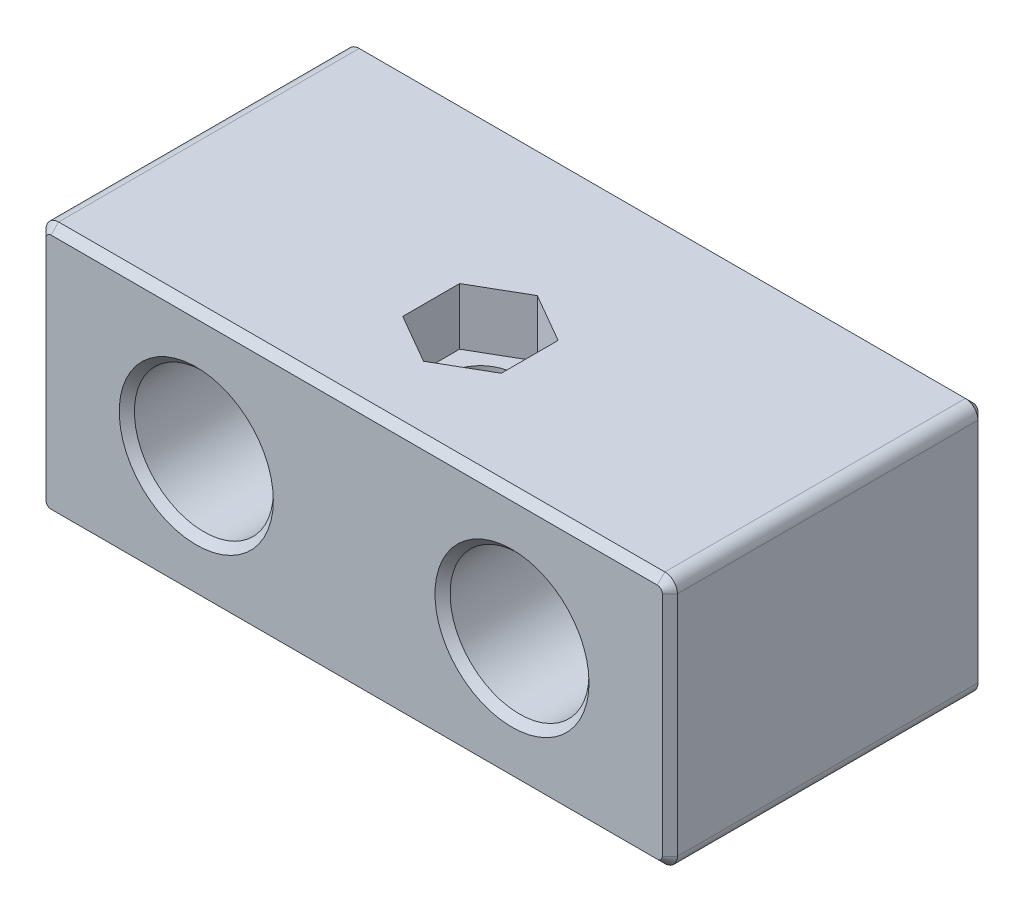
ISO-10303-21;
HEADER;
FILE_DESCRIPTION(('STEP AP214'),'2;1');
FILE_NAME('part.step','',(''),(''),'','','');
FILE_SCHEMA(('AUTOMOTIVE_DESIGN { 1 0 10303 214 1 1 1 1 }'));
ENDSEC;
DATA;
#1=APPLICATION_CONTEXT('core data for automotive mechanical design processes');
#2=APPLICATION_PROTOCOL_DEFINITION('international standard','automotive_design',2000,#1);
#3=PRODUCT_CONTEXT('',#1,'mechanical');
#4=PRODUCT('Part','Part','',(#3));
#5=PRODUCT_RELATED_PRODUCT_CATEGORY('part','',(#4));
#6=PRODUCT_DEFINITION_FORMATION('','',#4);
#7=PRODUCT_DEFINITION_CONTEXT('part definition',#1,'design');
#8=PRODUCT_DEFINITION('design','',#6,#7);
#9=PRODUCT_DEFINITION_SHAPE('','',#8);
#10=(LENGTH_UNIT() NAMED_UNIT(*) SI_UNIT(.MILLI.,.METRE.));
#11=(NAMED_UNIT(*) PLANE_ANGLE_UNIT() SI_UNIT($,.RADIAN.));
#12=(NAMED_UNIT(*) SI_UNIT($,.STERADIAN.) SOLID_ANGLE_UNIT());
#13=UNCERTAINTY_MEASURE_WITH_UNIT(LENGTH_MEASURE(1.E-05),#10,'distance_accuracy_value','');
#14=(GEOMETRIC_REPRESENTATION_CONTEXT(3) GLOBAL_UNCERTAINTY_ASSIGNED_CONTEXT((#13)) GLOBAL_UNIT_ASSIGNED_CONTEXT((#10,
#11,#12)) REPRESENTATION_CONTEXT('',''));
#15=CARTESIAN_POINT('',(0.,0.,0.));
#16=DIRECTION('',(0.,0.,1.));
#17=DIRECTION('',(1.,0.,0.));
#18=AXIS2_PLACEMENT_3D('',#15,#16,#17);
#19=CARTESIAN_POINT('',(0.,-10.,15.));
#20=DIRECTION('',(0.,-1.,0.));
#21=DIRECTION('',(0.,0.,-1.));
#22=AXIS2_PLACEMENT_3D('',#19,#20,#21);
#23=CYLINDRICAL_SURFACE('',#22,2.75);
#24=CARTESIAN_POINT('',(0.,-10.,15.));
#25=DIRECTION('',(0.,-1.,0.));
#26=DIRECTION('',(0.,0.,-1.));
#27=AXIS2_PLACEMENT_3D('',#24,#25,#26);
#28=CIRCLE('',#27,2.75);
#29=CARTESIAN_POINT('',(0.,-10.,12.25));
#30=VERTEX_POINT('',#29);
#31=EDGE_CURVE('E252',#30,#30,#28,.T.);
#32=ORIENTED_EDGE('',*,*,#31,.T.);
#33=EDGE_LOOP('',(#32));
#34=FACE_BOUND('',#33,.T.);
#35=CARTESIAN_POINT('',(0.,5.5,15.));
#36=DIRECTION('',(0.,1.,0.));
#37=DIRECTION('',(0.,0.,1.));
#38=AXIS2_PLACEMENT_3D('',#35,#36,#37);
#39=CIRCLE('',#38,2.75);
#40=CARTESIAN_POINT('',(0.,5.5,17.75));
#41=VERTEX_POINT('',#40);
#42=EDGE_CURVE('E244',#41,#41,#39,.F.);
#43=ORIENTED_EDGE('',*,*,#42,.F.);
#44=EDGE_LOOP('',(#43));
#45=FACE_BOUND('',#44,.T.);
#46=ADVANCED_FACE('F39',(#34,#45),#23,.F.);
#47=CARTESIAN_POINT('',(-25.,-10.,25.));
#48=DIRECTION('',(1.,0.,0.));
#49=DIRECTION('',(0.,0.,-1.));
#50=AXIS2_PLACEMENT_3D('',#47,#48,#49);
#51=PLANE('',#50);
#52=DIRECTION('',(0.,0.,-1.));
#53=VECTOR('',#52,1.);
#54=CARTESIAN_POINT('',(-25.,-9.,25.));
#55=LINE('',#54,#53);
#56=CARTESIAN_POINT('',(-25.,-9.,0.599999999999996));
#57=VERTEX_POINT('',#56);
#58=CARTESIAN_POINT('',(-25.,-9.,24.4));
#59=VERTEX_POINT('',#58);
#60=EDGE_CURVE('E267',#57,#59,#55,.F.);
#61=ORIENTED_EDGE('',*,*,#60,.T.);
#62=DIRECTION('',(0.,1.,0.));
#63=VECTOR('',#62,1.);
#64=CARTESIAN_POINT('',(-25.,9.,24.4));
#65=LINE('',#64,#63);
#66=CARTESIAN_POINT('',(-25.,9.,24.4));
#67=VERTEX_POINT('',#66);
#68=EDGE_CURVE('E340',#59,#67,#65,.T.);
#69=ORIENTED_EDGE('',*,*,#68,.T.);
#70=DIRECTION('',(0.,0.,-1.));
#71=VECTOR('',#70,1.);
#72=CARTESIAN_POINT('',(-25.,9.,25.));
#73=LINE('',#72,#71);
#74=CARTESIAN_POINT('',(-25.,9.,0.599999999999996));
#75=VERTEX_POINT('',#74);
#76=EDGE_CURVE('E272',#67,#75,#73,.T.);
#77=ORIENTED_EDGE('',*,*,#76,.T.);
#78=DIRECTION('',(0.,-1.,0.));
#79=VECTOR('',#78,1.);
#80=CARTESIAN_POINT('',(-25.,-10.,0.599999999999996));
#81=LINE('',#80,#79);
#82=EDGE_CURVE('E338',#75,#57,#81,.T.);
#83=ORIENTED_EDGE('',*,*,#82,.T.);
#84=EDGE_LOOP('',(#61,#69,#77,#83));
#85=FACE_BOUND('',#84,.T.);
#86=ADVANCED_FACE('F494',(#85),#51,.F.);
#87=CARTESIAN_POINT('',(25.,-9.99999999999999,25.));
#88=DIRECTION('',(0.,1.,0.));
#89=DIRECTION('',(-1.,0.,0.));
#90=AXIS2_PLACEMENT_3D('',#87,#88,#89);
#91=PLANE('',#90);
#92=ORIENTED_EDGE('',*,*,#31,.F.);
#93=EDGE_LOOP('',(#92));
#94=FACE_BOUND('',#93,.T.);
#95=DIRECTION('',(0.,0.,-1.));
#96=VECTOR('',#95,1.);
#97=CARTESIAN_POINT('',(24.,-9.99999999999999,25.));
#98=LINE('',#97,#96);
#99=CARTESIAN_POINT('',(24.,-9.99999999999999,0.599999999999996));
#100=VERTEX_POINT('',#99);
#101=CARTESIAN_POINT('',(24.,-9.99999999999999,24.4));
#102=VERTEX_POINT('',#101);
#103=EDGE_CURVE('E281',#100,#102,#98,.F.);
#104=ORIENTED_EDGE('',*,*,#103,.T.);
#105=DIRECTION('',(-1.,0.,0.));
#106=VECTOR('',#105,1.);
#107=CARTESIAN_POINT('',(-24.,-10.,24.4));
#108=LINE('',#107,#106);
#109=CARTESIAN_POINT('',(-24.,-10.,24.4));
#110=VERTEX_POINT('',#109);
#111=EDGE_CURVE('E331',#102,#110,#108,.T.);
#112=ORIENTED_EDGE('',*,*,#111,.T.);
#113=DIRECTION('',(0.,0.,-1.));
#114=VECTOR('',#113,1.);
#115=CARTESIAN_POINT('',(-24.,-10.,25.));
#116=LINE('',#115,#114);
#117=CARTESIAN_POINT('',(-24.,-10.,0.599999999999996));
#118=VERTEX_POINT('',#117);
#119=EDGE_CURVE('E284',#110,#118,#116,.T.);
#120=ORIENTED_EDGE('',*,*,#119,.T.);
#121=DIRECTION('',(1.,0.,0.));
#122=VECTOR('',#121,1.);
#123=CARTESIAN_POINT('',(25.,-9.99999999999999,0.599999999999996));
#124=LINE('',#123,#122);
#125=EDGE_CURVE('E329',#118,#100,#124,.T.);
#126=ORIENTED_EDGE('',*,*,#125,.T.);
#127=EDGE_LOOP('',(#104,#112,#120,#126));
#128=FACE_BOUND('',#127,.T.);
#129=ADVANCED_FACE('F477',(#94,#128),#91,.F.);
#130=CARTESIAN_POINT('',(25.,-9.99999999999999,25.));
#131=DIRECTION('',(-1.,0.,0.));
#132=DIRECTION('',(0.,0.,1.));
#133=AXIS2_PLACEMENT_3D('',#130,#131,#132);
#134=PLANE('',#133);
#135=DIRECTION('',(0.,0.,-1.));
#136=VECTOR('',#135,1.);
#137=CARTESIAN_POINT('',(25.,9.00000000000001,25.));
#138=LINE('',#137,#136);
#139=CARTESIAN_POINT('',(25.,9.00000000000001,0.599999999999996));
#140=VERTEX_POINT('',#139);
#141=CARTESIAN_POINT('',(25.,9.00000000000001,24.4));
#142=VERTEX_POINT('',#141);
#143=EDGE_CURVE('E290',#140,#142,#138,.F.);
#144=ORIENTED_EDGE('',*,*,#143,.T.);
#145=DIRECTION('',(0.,-1.,0.));
#146=VECTOR('',#145,1.);
#147=CARTESIAN_POINT('',(25.,-8.99999999999999,24.4));
#148=LINE('',#147,#146);
#149=CARTESIAN_POINT('',(25.,-8.99999999999999,24.4));
#150=VERTEX_POINT('',#149);
#151=EDGE_CURVE('E323',#142,#150,#148,.T.);
#152=ORIENTED_EDGE('',*,*,#151,.T.);
#153=DIRECTION('',(0.,0.,-1.));
#154=VECTOR('',#153,1.);
#155=CARTESIAN_POINT('',(25.,-8.99999999999999,25.));
#156=LINE('',#155,#154);
#157=CARTESIAN_POINT('',(25.,-8.99999999999999,0.599999999999996));
#158=VERTEX_POINT('',#157);
#159=EDGE_CURVE('E287',#150,#158,#156,.T.);
#160=ORIENTED_EDGE('',*,*,#159,.T.);
#161=DIRECTION('',(0.,1.,0.));
#162=VECTOR('',#161,1.);
#163=CARTESIAN_POINT('',(25.,-9.99999999999999,0.599999999999996));
#164=LINE('',#163,#162);
#165=EDGE_CURVE('E321',#158,#140,#164,.T.);
#166=ORIENTED_EDGE('',*,*,#165,.T.);
#167=EDGE_LOOP('',(#144,#152,#160,#166));
#168=FACE_BOUND('',#167,.T.);
#169=ADVANCED_FACE('F451',(#168),#134,.F.);
#170=CARTESIAN_POINT('',(25.,10.,25.));
#171=DIRECTION('',(0.,-1.,0.));
#172=DIRECTION('',(1.,0.,0.));
#173=AXIS2_PLACEMENT_3D('',#170,#171,#172);
#174=PLANE('',#173);
#175=DIRECTION('',(-0.866025403784436,0.,-0.500000000000004));
#176=VECTOR('',#175,1.);
#177=CARTESIAN_POINT('',(3.90000000000001,10.,12.7483339501605));
#178=LINE('',#177,#176);
#179=CARTESIAN_POINT('',(3.90000000000001,10.,12.7483339501605));
#180=VERTEX_POINT('',#179);
#181=CARTESIAN_POINT('',(0.,10.,10.4966679003209));
#182=VERTEX_POINT('',#181);
#183=EDGE_CURVE('E231',#180,#182,#178,.T.);
#184=ORIENTED_EDGE('',*,*,#183,.F.);
#185=DIRECTION('',(0.,0.,-1.));
#186=VECTOR('',#185,1.);
#187=CARTESIAN_POINT('',(3.89999999999999,10.,17.2516660498396));
#188=LINE('',#187,#186);
#189=CARTESIAN_POINT('',(3.89999999999999,10.,17.2516660498396));
#190=VERTEX_POINT('',#189);
#191=EDGE_CURVE('E198',#190,#180,#188,.T.);
#192=ORIENTED_EDGE('',*,*,#191,.F.);
#193=DIRECTION('',(0.866025403784441,0.,-0.499999999999996));
#194=VECTOR('',#193,1.);
#195=CARTESIAN_POINT('',(0.,10.,19.5033320996791));
#196=LINE('',#195,#194);
#197=CARTESIAN_POINT('',(0.,10.,19.5033320996791));
#198=VERTEX_POINT('',#197);
#199=EDGE_CURVE('E217',#198,#190,#196,.T.);
#200=ORIENTED_EDGE('',*,*,#199,.F.);
#201=DIRECTION('',(0.866025403784436,0.,0.500000000000005));
#202=VECTOR('',#201,1.);
#203=CARTESIAN_POINT('',(-3.90000000000001,10.,17.2516660498395));
#204=LINE('',#203,#202);
#205=CARTESIAN_POINT('',(-3.90000000000001,10.,17.2516660498395));
#206=VERTEX_POINT('',#205);
#207=EDGE_CURVE('E220',#206,#198,#204,.T.);
#208=ORIENTED_EDGE('',*,*,#207,.F.);
#209=DIRECTION('',(0.,0.,1.));
#210=VECTOR('',#209,1.);
#211=CARTESIAN_POINT('',(-3.89999999999999,10.,12.7483339501604));
#212=LINE('',#211,#210);
#213=CARTESIAN_POINT('',(-3.89999999999999,10.,12.7483339501604));
#214=VERTEX_POINT('',#213);
#215=EDGE_CURVE('E237',#214,#206,#212,.T.);
#216=ORIENTED_EDGE('',*,*,#215,.F.);
#217=DIRECTION('',(-0.866025403784441,0.,0.499999999999996));
#218=VECTOR('',#217,1.);
#219=CARTESIAN_POINT('',(0.,10.,10.4966679003209));
#220=LINE('',#219,#218);
#221=EDGE_CURVE('E234',#182,#214,#220,.T.);
#222=ORIENTED_EDGE('',*,*,#221,.F.);
#223=EDGE_LOOP('',(#184,#192,#200,#208,#216,#222));
#224=FACE_BOUND('',#223,.T.);
#225=DIRECTION('',(0.,0.,-1.));
#226=VECTOR('',#225,1.);
#227=CARTESIAN_POINT('',(-24.,10.,25.));
#228=LINE('',#227,#226);
#229=CARTESIAN_POINT('',(-24.,10.,0.599999999999996));
#230=VERTEX_POINT('',#229);
#231=CARTESIAN_POINT('',(-24.,10.,24.4));
#232=VERTEX_POINT('',#231);
#233=EDGE_CURVE('E278',#230,#232,#228,.F.);
#234=ORIENTED_EDGE('',*,*,#233,.T.);
#235=DIRECTION('',(1.,0.,0.));
#236=VECTOR('',#235,1.);
#237=CARTESIAN_POINT('',(24.,10.,24.4));
#238=LINE('',#237,#236);
#239=CARTESIAN_POINT('',(24.,10.,24.4));
#240=VERTEX_POINT('',#239);
#241=EDGE_CURVE('E348',#232,#240,#238,.T.);
#242=ORIENTED_EDGE('',*,*,#241,.T.);
#243=DIRECTION('',(0.,0.,-1.));
#244=VECTOR('',#243,1.);
#245=CARTESIAN_POINT('',(24.,10.,25.));
#246=LINE('',#245,#244);
#247=CARTESIAN_POINT('',(24.,10.,0.599999999999996));
#248=VERTEX_POINT('',#247);
#249=EDGE_CURVE('E275',#240,#248,#246,.T.);
#250=ORIENTED_EDGE('',*,*,#249,.T.);
#251=DIRECTION('',(-1.,0.,0.));
#252=VECTOR('',#251,1.);
#253=CARTESIAN_POINT('',(25.,10.,0.599999999999996));
#254=LINE('',#253,#252);
#255=EDGE_CURVE('E346',#248,#230,#254,.T.);
#256=ORIENTED_EDGE('',*,*,#255,.T.);
#257=EDGE_LOOP('',(#234,#242,#250,#256));
#258=FACE_BOUND('',#257,.T.);
#259=ADVANCED_FACE('F437',(#224,#258),#174,.F.);
#260=CARTESIAN_POINT('',(0.,0.,25.));
#261=DIRECTION('',(0.,0.,1.));
#262=DIRECTION('',(1.,0.,0.));
#263=AXIS2_PLACEMENT_3D('',#260,#261,#262);
#264=PLANE('',#263);
#265=DIRECTION('',(0.,1.,0.));
#266=VECTOR('',#265,1.);
#267=CARTESIAN_POINT('',(24.4,9.00000000000001,25.));
#268=LINE('',#267,#266);
#269=CARTESIAN_POINT('',(24.4,-8.99999999999999,25.));
#270=VERTEX_POINT('',#269);
#271=CARTESIAN_POINT('',(24.4,9.00000000000001,25.));
#272=VERTEX_POINT('',#271);
#273=EDGE_CURVE('E311',#270,#272,#268,.T.);
#274=ORIENTED_EDGE('',*,*,#273,.T.);
#275=CARTESIAN_POINT('',(24.,9.00000000000001,25.));
#276=DIRECTION('',(0.,0.,1.));
#277=DIRECTION('',(1.,0.,0.));
#278=AXIS2_PLACEMENT_3D('',#275,#276,#277);
#279=CIRCLE('',#278,0.400000000000018);
#280=CARTESIAN_POINT('',(24.,9.40000000000002,25.));
#281=VERTEX_POINT('',#280);
#282=EDGE_CURVE('E313',#272,#281,#279,.T.);
#283=ORIENTED_EDGE('',*,*,#282,.T.);
#284=DIRECTION('',(-1.,0.,0.));
#285=VECTOR('',#284,1.);
#286=CARTESIAN_POINT('',(-24.,9.40000000000002,25.));
#287=LINE('',#286,#285);
#288=CARTESIAN_POINT('',(-24.,9.40000000000002,25.));
#289=VERTEX_POINT('',#288);
#290=EDGE_CURVE('E299',#281,#289,#287,.T.);
#291=ORIENTED_EDGE('',*,*,#290,.T.);
#292=CARTESIAN_POINT('',(-24.,9.,25.));
#293=DIRECTION('',(0.,0.,1.));
#294=DIRECTION('',(1.,0.,0.));
#295=AXIS2_PLACEMENT_3D('',#292,#293,#294);
#296=CIRCLE('',#295,0.400000000000018);
#297=CARTESIAN_POINT('',(-24.4,9.,25.));
#298=VERTEX_POINT('',#297);
#299=EDGE_CURVE('E301',#289,#298,#296,.T.);
#300=ORIENTED_EDGE('',*,*,#299,.T.);
#301=DIRECTION('',(0.,-1.,0.));
#302=VECTOR('',#301,1.);
#303=CARTESIAN_POINT('',(-24.4,-9.,25.));
#304=LINE('',#303,#302);
#305=CARTESIAN_POINT('',(-24.4,-9.,25.));
#306=VERTEX_POINT('',#305);
#307=EDGE_CURVE('E303',#298,#306,#304,.T.);
#308=ORIENTED_EDGE('',*,*,#307,.T.);
#309=CARTESIAN_POINT('',(-24.,-9.,25.));
#310=DIRECTION('',(0.,0.,1.));
#311=DIRECTION('',(1.,0.,0.));
#312=AXIS2_PLACEMENT_3D('',#309,#310,#311);
#313=CIRCLE('',#312,0.400000000000018);
#314=CARTESIAN_POINT('',(-24.,-9.40000000000002,25.));
#315=VERTEX_POINT('',#314);
#316=EDGE_CURVE('E305',#306,#315,#313,.T.);
#317=ORIENTED_EDGE('',*,*,#316,.T.);
#318=DIRECTION('',(1.,0.,0.));
#319=VECTOR('',#318,1.);
#320=CARTESIAN_POINT('',(24.,-9.40000000000001,25.));
#321=LINE('',#320,#319);
#322=CARTESIAN_POINT('',(24.,-9.40000000000001,25.));
#323=VERTEX_POINT('',#322);
#324=EDGE_CURVE('E307',#315,#323,#321,.T.);
#325=ORIENTED_EDGE('',*,*,#324,.T.);
#326=CARTESIAN_POINT('',(24.,-8.99999999999999,25.));
#327=DIRECTION('',(0.,0.,1.));
#328=DIRECTION('',(1.,0.,0.));
#329=AXIS2_PLACEMENT_3D('',#326,#327,#328);
#330=CIRCLE('',#329,0.400000000000018);
#331=EDGE_CURVE('E309',#323,#270,#330,.T.);
#332=ORIENTED_EDGE('',*,*,#331,.T.);
#333=EDGE_LOOP('',(#274,#283,#291,#300,#308,#317,#325,#332));
#334=FACE_BOUND('',#333,.T.);
#335=CARTESIAN_POINT('',(12.5,0.,25.));
#336=DIRECTION('',(0.,0.,1.));
#337=DIRECTION('',(1.,0.,0.));
#338=AXIS2_PLACEMENT_3D('',#335,#336,#337);
#339=CIRCLE('',#338,6.10000000000003);
#340=CARTESIAN_POINT('',(18.6,0.,25.));
#341=VERTEX_POINT('',#340);
#342=EDGE_CURVE('E296',#341,#341,#339,.F.);
#343=ORIENTED_EDGE('',*,*,#342,.T.);
#344=EDGE_LOOP('',(#343));
#345=FACE_BOUND('',#344,.T.);
#346=CARTESIAN_POINT('',(-12.5,0.,25.));
#347=DIRECTION('',(0.,0.,1.));
#348=DIRECTION('',(1.,0.,0.));
#349=AXIS2_PLACEMENT_3D('',#346,#347,#348);
#350=CIRCLE('',#349,6.10000000000003);
#351=CARTESIAN_POINT('',(-6.39999999999997,0.,25.));
#352=VERTEX_POINT('',#351);
#353=EDGE_CURVE('E293',#352,#352,#350,.F.);
#354=ORIENTED_EDGE('',*,*,#353,.T.);
#355=EDGE_LOOP('',(#354));
#356=FACE_BOUND('',#355,.T.);
#357=ADVANCED_FACE('F467',(#334,#345,#356),#264,.T.);
#358=CARTESIAN_POINT('',(0.,0.,0.));
#359=DIRECTION('',(0.,0.,1.));
#360=DIRECTION('',(1.,0.,0.));
#361=AXIS2_PLACEMENT_3D('',#358,#359,#360);
#362=PLANE('',#361);
#363=DIRECTION('',(-1.,0.,0.));
#364=VECTOR('',#363,1.);
#365=CARTESIAN_POINT('',(0.,-9.4,0.));
#366=LINE('',#365,#364);
#367=CARTESIAN_POINT('',(24.,-9.4,0.));
#368=VERTEX_POINT('',#367);
#369=CARTESIAN_POINT('',(-24.,-9.40000000000001,0.));
#370=VERTEX_POINT('',#369);
#371=EDGE_CURVE('E57',#368,#370,#366,.T.);
#372=ORIENTED_EDGE('',*,*,#371,.T.);
#373=CARTESIAN_POINT('',(-24.,-9.,0.));
#374=DIRECTION('',(0.,0.,1.));
#375=DIRECTION('',(1.,0.,0.));
#376=AXIS2_PLACEMENT_3D('',#373,#374,#375);
#377=CIRCLE('',#376,0.400000000000005);
#378=CARTESIAN_POINT('',(-24.4,-9.,0.));
#379=VERTEX_POINT('',#378);
#380=EDGE_CURVE('E374',#370,#379,#377,.F.);
#381=ORIENTED_EDGE('',*,*,#380,.T.);
#382=DIRECTION('',(0.,1.,0.));
#383=VECTOR('',#382,1.);
#384=CARTESIAN_POINT('',(-24.4,0.,0.));
#385=LINE('',#384,#383);
#386=CARTESIAN_POINT('',(-24.4,9.,0.));
#387=VERTEX_POINT('',#386);
#388=EDGE_CURVE('E362',#379,#387,#385,.T.);
#389=ORIENTED_EDGE('',*,*,#388,.T.);
#390=CARTESIAN_POINT('',(-24.,9.,0.));
#391=DIRECTION('',(0.,0.,1.));
#392=DIRECTION('',(1.,0.,0.));
#393=AXIS2_PLACEMENT_3D('',#390,#391,#392);
#394=CIRCLE('',#393,0.400000000000005);
#395=CARTESIAN_POINT('',(-24.,9.4,0.));
#396=VERTEX_POINT('',#395);
#397=EDGE_CURVE('E364',#387,#396,#394,.F.);
#398=ORIENTED_EDGE('',*,*,#397,.T.);
#399=DIRECTION('',(1.,0.,0.));
#400=VECTOR('',#399,1.);
#401=CARTESIAN_POINT('',(0.,9.40000000000001,0.));
#402=LINE('',#401,#400);
#403=CARTESIAN_POINT('',(24.,9.40000000000001,0.));
#404=VERTEX_POINT('',#403);
#405=EDGE_CURVE('E366',#396,#404,#402,.T.);
#406=ORIENTED_EDGE('',*,*,#405,.T.);
#407=CARTESIAN_POINT('',(24.,9.00000000000001,0.));
#408=DIRECTION('',(0.,0.,1.));
#409=DIRECTION('',(1.,0.,0.));
#410=AXIS2_PLACEMENT_3D('',#407,#408,#409);
#411=CIRCLE('',#410,0.400000000000005);
#412=CARTESIAN_POINT('',(24.4,9.00000000000001,0.));
#413=VERTEX_POINT('',#412);
#414=EDGE_CURVE('E368',#404,#413,#411,.F.);
#415=ORIENTED_EDGE('',*,*,#414,.T.);
#416=DIRECTION('',(0.,-1.,0.));
#417=VECTOR('',#416,1.);
#418=CARTESIAN_POINT('',(24.4,0.,0.));
#419=LINE('',#418,#417);
#420=CARTESIAN_POINT('',(24.4,-8.99999999999999,0.));
#421=VERTEX_POINT('',#420);
#422=EDGE_CURVE('E370',#413,#421,#419,.T.);
#423=ORIENTED_EDGE('',*,*,#422,.T.);
#424=CARTESIAN_POINT('',(24.,-8.99999999999999,0.));
#425=DIRECTION('',(0.,0.,1.));
#426=DIRECTION('',(1.,0.,0.));
#427=AXIS2_PLACEMENT_3D('',#424,#425,#426);
#428=CIRCLE('',#427,0.400000000000005);
#429=EDGE_CURVE('E62',#421,#368,#428,.F.);
#430=ORIENTED_EDGE('',*,*,#429,.T.);
#431=EDGE_LOOP('',(#372,#381,#389,#398,#406,#415,#423,#430));
#432=FACE_BOUND('',#431,.T.);
#433=CARTESIAN_POINT('',(12.5,0.,0.));
#434=DIRECTION('',(0.,0.,1.));
#435=DIRECTION('',(1.,0.,0.));
#436=AXIS2_PLACEMENT_3D('',#433,#434,#435);
#437=CIRCLE('',#436,3.8);
#438=CARTESIAN_POINT('',(16.3,0.,0.));
#439=VERTEX_POINT('',#438);
#440=EDGE_CURVE('E359',#439,#439,#437,.T.);
#441=ORIENTED_EDGE('',*,*,#440,.T.);
#442=EDGE_LOOP('',(#441));
#443=FACE_BOUND('',#442,.T.);
#444=CARTESIAN_POINT('',(-12.5,0.,0.));
#445=DIRECTION('',(0.,0.,1.));
#446=DIRECTION('',(1.,0.,0.));
#447=AXIS2_PLACEMENT_3D('',#444,#445,#446);
#448=CIRCLE('',#447,3.79999999999999);
#449=CARTESIAN_POINT('',(-8.70000000000001,0.,0.));
#450=VERTEX_POINT('',#449);
#451=EDGE_CURVE('E356',#450,#450,#448,.T.);
#452=ORIENTED_EDGE('',*,*,#451,.T.);
#453=EDGE_LOOP('',(#452));
#454=FACE_BOUND('',#453,.T.);
#455=ADVANCED_FACE('F560',(#432,#443,#454),#362,.F.);
#456=CARTESIAN_POINT('',(12.5,0.,25.));
#457=DIRECTION('',(0.,0.,1.));
#458=DIRECTION('',(1.,0.,0.));
#459=AXIS2_PLACEMENT_3D('',#456,#457,#458);
#460=CYLINDRICAL_SURFACE('',#459,3.2);
#461=CARTESIAN_POINT('',(12.5,0.,0.6));
#462=DIRECTION('',(0.,0.,1.));
#463=DIRECTION('',(1.,0.,0.));
#464=AXIS2_PLACEMENT_3D('',#461,#462,#463);
#465=CIRCLE('',#464,3.2);
#466=CARTESIAN_POINT('',(15.7,0.,0.6));
#467=VERTEX_POINT('',#466);
#468=EDGE_CURVE('E49',#467,#467,#465,.F.);
#469=ORIENTED_EDGE('',*,*,#468,.T.);
#470=EDGE_LOOP('',(#469));
#471=FACE_BOUND('',#470,.T.);
#472=CARTESIAN_POINT('',(12.5,0.,13.));
#473=DIRECTION('',(0.,0.,1.));
#474=DIRECTION('',(1.,0.,0.));
#475=AXIS2_PLACEMENT_3D('',#472,#473,#474);
#476=CIRCLE('',#475,3.2);
#477=CARTESIAN_POINT('',(15.7,0.,13.));
#478=VERTEX_POINT('',#477);
#479=EDGE_CURVE('E264',#478,#478,#476,.T.);
#480=ORIENTED_EDGE('',*,*,#479,.T.);
#481=EDGE_LOOP('',(#480));
#482=FACE_BOUND('',#481,.T.);
#483=ADVANCED_FACE('F556',(#471,#482),#460,.F.);
#484=CARTESIAN_POINT('',(15.7,0.,13.));
#485=DIRECTION('',(0.,0.,-1.));
#486=DIRECTION('',(-1.,0.,0.));
#487=AXIS2_PLACEMENT_3D('',#484,#485,#486);
#488=PLANE('',#487);
#489=ORIENTED_EDGE('',*,*,#479,.F.);
#490=EDGE_LOOP('',(#489));
#491=FACE_BOUND('',#490,.T.);
#492=CARTESIAN_POINT('',(12.5,0.,13.));
#493=DIRECTION('',(0.,0.,1.));
#494=DIRECTION('',(1.,0.,0.));
#495=AXIS2_PLACEMENT_3D('',#492,#493,#494);
#496=CIRCLE('',#495,5.5);
#497=CARTESIAN_POINT('',(18.,0.,13.));
#498=VERTEX_POINT('',#497);
#499=EDGE_CURVE('E261',#498,#498,#496,.T.);
#500=ORIENTED_EDGE('',*,*,#499,.T.);
#501=EDGE_LOOP('',(#500));
#502=FACE_BOUND('',#501,.T.);
#503=ADVANCED_FACE('F552',(#491,#502),#488,.F.);
#504=CARTESIAN_POINT('',(12.5,0.,25.));
#505=DIRECTION('',(0.,0.,1.));
#506=DIRECTION('',(1.,0.,0.));
#507=AXIS2_PLACEMENT_3D('',#504,#505,#506);
#508=CYLINDRICAL_SURFACE('',#507,5.5);
#509=CARTESIAN_POINT('',(12.5,0.,24.4));
#510=DIRECTION('',(0.,0.,1.));
#511=DIRECTION('',(1.,0.,0.));
#512=AXIS2_PLACEMENT_3D('',#509,#510,#511);
#513=CIRCLE('',#512,5.5);
#514=CARTESIAN_POINT('',(18.,0.,24.4));
#515=VERTEX_POINT('',#514);
#516=EDGE_CURVE('E350',#515,#515,#513,.T.);
#517=ORIENTED_EDGE('',*,*,#516,.T.);
#518=EDGE_LOOP('',(#517));
#519=FACE_BOUND('',#518,.T.);
#520=ORIENTED_EDGE('',*,*,#499,.F.);
#521=EDGE_LOOP('',(#520));
#522=FACE_BOUND('',#521,.T.);
#523=ADVANCED_FACE('F548',(#519,#522),#508,.F.);
#524=CARTESIAN_POINT('',(-12.5,0.,25.));
#525=DIRECTION('',(0.,0.,1.));
#526=DIRECTION('',(1.,0.,0.));
#527=AXIS2_PLACEMENT_3D('',#524,#525,#526);
#528=CYLINDRICAL_SURFACE('',#527,3.2);
#529=CARTESIAN_POINT('',(-12.5,0.,0.600000000000003));
#530=DIRECTION('',(0.,0.,1.));
#531=DIRECTION('',(1.,0.,0.));
#532=AXIS2_PLACEMENT_3D('',#529,#530,#531);
#533=CIRCLE('',#532,3.2);
#534=CARTESIAN_POINT('',(-9.3,0.,0.600000000000003));
#535=VERTEX_POINT('',#534);
#536=EDGE_CURVE('E11',#535,#535,#533,.F.);
#537=ORIENTED_EDGE('',*,*,#536,.T.);
#538=EDGE_LOOP('',(#537));
#539=FACE_BOUND('',#538,.T.);
#540=CARTESIAN_POINT('',(-12.5,0.,13.));
#541=DIRECTION('',(0.,0.,1.));
#542=DIRECTION('',(1.,0.,0.));
#543=AXIS2_PLACEMENT_3D('',#540,#541,#542);
#544=CIRCLE('',#543,3.2);
#545=CARTESIAN_POINT('',(-9.3,0.,13.));
#546=VERTEX_POINT('',#545);
#547=EDGE_CURVE('E258',#546,#546,#544,.T.);
#548=ORIENTED_EDGE('',*,*,#547,.T.);
#549=EDGE_LOOP('',(#548));
#550=FACE_BOUND('',#549,.T.);
#551=ADVANCED_FACE('F544',(#539,#550),#528,.F.);
#552=CARTESIAN_POINT('',(-9.3,0.,13.));
#553=DIRECTION('',(0.,0.,-1.));
#554=DIRECTION('',(-1.,0.,0.));
#555=AXIS2_PLACEMENT_3D('',#552,#553,#554);
#556=PLANE('',#555);
#557=ORIENTED_EDGE('',*,*,#547,.F.);
#558=EDGE_LOOP('',(#557));
#559=FACE_BOUND('',#558,.T.);
#560=CARTESIAN_POINT('',(-12.5,0.,13.));
#561=DIRECTION('',(0.,0.,1.));
#562=DIRECTION('',(1.,0.,0.));
#563=AXIS2_PLACEMENT_3D('',#560,#561,#562);
#564=CIRCLE('',#563,5.5);
#565=CARTESIAN_POINT('',(-7.,0.,13.));
#566=VERTEX_POINT('',#565);
#567=EDGE_CURVE('E255',#566,#566,#564,.T.);
#568=ORIENTED_EDGE('',*,*,#567,.T.);
#569=EDGE_LOOP('',(#568));
#570=FACE_BOUND('',#569,.T.);
#571=ADVANCED_FACE('F540',(#559,#570),#556,.F.);
#572=CARTESIAN_POINT('',(-12.5,0.,25.));
#573=DIRECTION('',(0.,0.,1.));
#574=DIRECTION('',(1.,0.,0.));
#575=AXIS2_PLACEMENT_3D('',#572,#573,#574);
#576=CYLINDRICAL_SURFACE('',#575,5.5);
#577=CARTESIAN_POINT('',(-12.5,0.,24.4));
#578=DIRECTION('',(0.,0.,1.));
#579=DIRECTION('',(1.,0.,0.));
#580=AXIS2_PLACEMENT_3D('',#577,#578,#579);
#581=CIRCLE('',#580,5.5);
#582=CARTESIAN_POINT('',(-7.,0.,24.4));
#583=VERTEX_POINT('',#582);
#584=EDGE_CURVE('E353',#583,#583,#581,.T.);
#585=ORIENTED_EDGE('',*,*,#584,.T.);
#586=EDGE_LOOP('',(#585));
#587=FACE_BOUND('',#586,.T.);
#588=ORIENTED_EDGE('',*,*,#567,.F.);
#589=EDGE_LOOP('',(#588));
#590=FACE_BOUND('',#589,.T.);
#591=ADVANCED_FACE('F537',(#587,#590),#576,.F.);
#592=CARTESIAN_POINT('',(0.,5.5,0.));
#593=DIRECTION('',(0.,1.,0.));
#594=DIRECTION('',(0.,0.,1.));
#595=AXIS2_PLACEMENT_3D('',#592,#593,#594);
#596=PLANE('',#595);
#597=DIRECTION('',(0.,0.,-1.));
#598=VECTOR('',#597,1.);
#599=CARTESIAN_POINT('',(3.89999999999999,5.5,17.2516660498396));
#600=LINE('',#599,#598);
#601=CARTESIAN_POINT('',(3.89999999999999,5.5,17.2516660498396));
#602=VERTEX_POINT('',#601);
#603=CARTESIAN_POINT('',(3.90000000000001,5.5,12.7483339501605));
#604=VERTEX_POINT('',#603);
#605=EDGE_CURVE('E195',#602,#604,#600,.T.);
#606=ORIENTED_EDGE('',*,*,#605,.T.);
#607=DIRECTION('',(-0.866025403784436,0.,-0.500000000000004));
#608=VECTOR('',#607,1.);
#609=CARTESIAN_POINT('',(3.90000000000001,5.5,12.7483339501605));
#610=LINE('',#609,#608);
#611=CARTESIAN_POINT('',(0.,5.5,10.4966679003209));
#612=VERTEX_POINT('',#611);
#613=EDGE_CURVE('E206',#604,#612,#610,.T.);
#614=ORIENTED_EDGE('',*,*,#613,.T.);
#615=DIRECTION('',(-0.866025403784441,0.,0.499999999999996));
#616=VECTOR('',#615,1.);
#617=CARTESIAN_POINT('',(0.,5.5,10.4966679003209));
#618=LINE('',#617,#616);
#619=CARTESIAN_POINT('',(-3.89999999999999,5.5,12.7483339501604));
#620=VERTEX_POINT('',#619);
#621=EDGE_CURVE('E211',#612,#620,#618,.T.);
#622=ORIENTED_EDGE('',*,*,#621,.T.);
#623=DIRECTION('',(0.,0.,1.));
#624=VECTOR('',#623,1.);
#625=CARTESIAN_POINT('',(-3.89999999999999,5.5,12.7483339501604));
#626=LINE('',#625,#624);
#627=CARTESIAN_POINT('',(-3.90000000000001,5.5,17.2516660498395));
#628=VERTEX_POINT('',#627);
#629=EDGE_CURVE('E224',#620,#628,#626,.T.);
#630=ORIENTED_EDGE('',*,*,#629,.T.);
#631=DIRECTION('',(0.866025403784436,0.,0.500000000000005));
#632=VECTOR('',#631,1.);
#633=CARTESIAN_POINT('',(-3.90000000000001,5.5,17.2516660498395));
#634=LINE('',#633,#632);
#635=CARTESIAN_POINT('',(0.,5.5,19.5033320996791));
#636=VERTEX_POINT('',#635);
#637=EDGE_CURVE('E227',#628,#636,#634,.T.);
#638=ORIENTED_EDGE('',*,*,#637,.T.);
#639=DIRECTION('',(0.866025403784441,0.,-0.499999999999996));
#640=VECTOR('',#639,1.);
#641=CARTESIAN_POINT('',(0.,5.5,19.5033320996791));
#642=LINE('',#641,#640);
#643=EDGE_CURVE('E203',#636,#602,#642,.T.);
#644=ORIENTED_EDGE('',*,*,#643,.T.);
#645=EDGE_LOOP('',(#606,#614,#622,#630,#638,#644));
#646=FACE_BOUND('',#645,.T.);
#647=ORIENTED_EDGE('',*,*,#42,.T.);
#648=EDGE_LOOP('',(#647));
#649=FACE_BOUND('',#648,.T.);
#650=ADVANCED_FACE('F213',(#646,#649),#596,.T.);
#651=CARTESIAN_POINT('',(3.89999999999999,5.5,17.2516660498396));
#652=DIRECTION('',(1.,0.,0.));
#653=DIRECTION('',(0.,0.,-1.));
#654=AXIS2_PLACEMENT_3D('',#651,#652,#653);
#655=PLANE('',#654);
#656=ORIENTED_EDGE('',*,*,#191,.T.);
#657=DIRECTION('',(0.,1.,0.));
#658=VECTOR('',#657,1.);
#659=CARTESIAN_POINT('',(3.90000000000001,5.5,12.7483339501605));
#660=LINE('',#659,#658);
#661=EDGE_CURVE('E191',#604,#180,#660,.T.);
#662=ORIENTED_EDGE('',*,*,#661,.F.);
#663=ORIENTED_EDGE('',*,*,#605,.F.);
#664=DIRECTION('',(0.,1.,0.));
#665=VECTOR('',#664,1.);
#666=CARTESIAN_POINT('',(3.89999999999999,5.5,17.2516660498396));
#667=LINE('',#666,#665);
#668=EDGE_CURVE('E242',#602,#190,#667,.T.);
#669=ORIENTED_EDGE('',*,*,#668,.T.);
#670=EDGE_LOOP('',(#656,#662,#663,#669));
#671=FACE_BOUND('',#670,.T.);
#672=ADVANCED_FACE('F193',(#671),#655,.F.);
#673=CARTESIAN_POINT('',(0.,5.5,19.5033320996791));
#674=DIRECTION('',(0.499999999999996,0.,0.866025403784441));
#675=DIRECTION('',(0.866025403784441,0.,-0.499999999999996));
#676=AXIS2_PLACEMENT_3D('',#673,#674,#675);
#677=PLANE('',#676);
#678=ORIENTED_EDGE('',*,*,#199,.T.);
#679=ORIENTED_EDGE('',*,*,#668,.F.);
#680=ORIENTED_EDGE('',*,*,#643,.F.);
#681=DIRECTION('',(0.,1.,0.));
#682=VECTOR('',#681,1.);
#683=CARTESIAN_POINT('',(0.,5.5,19.5033320996791));
#684=LINE('',#683,#682);
#685=EDGE_CURVE('E245',#636,#198,#684,.T.);
#686=ORIENTED_EDGE('',*,*,#685,.T.);
#687=EDGE_LOOP('',(#678,#679,#680,#686));
#688=FACE_BOUND('',#687,.T.);
#689=ADVANCED_FACE('F972',(#688),#677,.F.);
#690=CARTESIAN_POINT('',(-3.90000000000001,5.5,17.2516660498395));
#691=DIRECTION('',(-0.500000000000005,0.,0.866025403784436));
#692=DIRECTION('',(0.866025403784436,0.,0.500000000000005));
#693=AXIS2_PLACEMENT_3D('',#690,#691,#692);
#694=PLANE('',#693);
#695=ORIENTED_EDGE('',*,*,#207,.T.);
#696=ORIENTED_EDGE('',*,*,#685,.F.);
#697=ORIENTED_EDGE('',*,*,#637,.F.);
#698=DIRECTION('',(0.,1.,0.));
#699=VECTOR('',#698,1.);
#700=CARTESIAN_POINT('',(-3.90000000000001,5.5,17.2516660498395));
#701=LINE('',#700,#699);
#702=EDGE_CURVE('E247',#628,#206,#701,.T.);
#703=ORIENTED_EDGE('',*,*,#702,.T.);
#704=EDGE_LOOP('',(#695,#696,#697,#703));
#705=FACE_BOUND('',#704,.T.);
#706=ADVANCED_FACE('F961',(#705),#694,.F.);
#707=CARTESIAN_POINT('',(-3.89999999999999,5.5,12.7483339501604));
#708=DIRECTION('',(-1.,0.,0.));
#709=DIRECTION('',(0.,0.,1.));
#710=AXIS2_PLACEMENT_3D('',#707,#708,#709);
#711=PLANE('',#710);
#712=ORIENTED_EDGE('',*,*,#215,.T.);
#713=ORIENTED_EDGE('',*,*,#702,.F.);
#714=ORIENTED_EDGE('',*,*,#629,.F.);
#715=DIRECTION('',(0.,1.,0.));
#716=VECTOR('',#715,1.);
#717=CARTESIAN_POINT('',(-3.89999999999999,5.5,12.7483339501604));
#718=LINE('',#717,#716);
#719=EDGE_CURVE('E249',#620,#214,#718,.T.);
#720=ORIENTED_EDGE('',*,*,#719,.T.);
#721=EDGE_LOOP('',(#712,#713,#714,#720));
#722=FACE_BOUND('',#721,.T.);
#723=ADVANCED_FACE('F950',(#722),#711,.F.);
#724=CARTESIAN_POINT('',(0.,5.5,10.4966679003209));
#725=DIRECTION('',(-0.499999999999996,0.,-0.866025403784441));
#726=DIRECTION('',(-0.866025403784441,0.,0.499999999999996));
#727=AXIS2_PLACEMENT_3D('',#724,#725,#726);
#728=PLANE('',#727);
#729=ORIENTED_EDGE('',*,*,#221,.T.);
#730=ORIENTED_EDGE('',*,*,#719,.F.);
#731=ORIENTED_EDGE('',*,*,#621,.F.);
#732=DIRECTION('',(0.,1.,0.));
#733=VECTOR('',#732,1.);
#734=CARTESIAN_POINT('',(0.,5.5,10.4966679003209));
#735=LINE('',#734,#733);
#736=EDGE_CURVE('E202',#612,#182,#735,.T.);
#737=ORIENTED_EDGE('',*,*,#736,.T.);
#738=EDGE_LOOP('',(#729,#730,#731,#737));
#739=FACE_BOUND('',#738,.T.);
#740=ADVANCED_FACE('F941',(#739),#728,.F.);
#741=CARTESIAN_POINT('',(3.90000000000001,5.5,12.7483339501605));
#742=DIRECTION('',(0.500000000000004,0.,-0.866025403784436));
#743=DIRECTION('',(-0.866025403784436,0.,-0.500000000000005));
#744=AXIS2_PLACEMENT_3D('',#741,#742,#743);
#745=PLANE('',#744);
#746=ORIENTED_EDGE('',*,*,#183,.T.);
#747=ORIENTED_EDGE('',*,*,#736,.F.);
#748=ORIENTED_EDGE('',*,*,#613,.F.);
#749=ORIENTED_EDGE('',*,*,#661,.T.);
#750=EDGE_LOOP('',(#746,#747,#748,#749));
#751=FACE_BOUND('',#750,.T.);
#752=ADVANCED_FACE('F207',(#751),#745,.F.);
#753=CARTESIAN_POINT('',(-24.,9.,25.));
#754=DIRECTION('',(0.,0.,-1.));
#755=DIRECTION('',(-1.,0.,0.));
#756=AXIS2_PLACEMENT_3D('',#753,#754,#755);
#757=CYLINDRICAL_SURFACE('',#756,1.);
#758=ORIENTED_EDGE('',*,*,#76,.F.);
#759=CARTESIAN_POINT('',(-24.,9.,24.4));
#760=DIRECTION('',(0.,0.,1.));
#761=DIRECTION('',(1.,0.,0.));
#762=AXIS2_PLACEMENT_3D('',#759,#760,#761);
#763=CIRCLE('',#762,1.);
#764=EDGE_CURVE('E344',#67,#232,#763,.F.);
#765=ORIENTED_EDGE('',*,*,#764,.T.);
#766=ORIENTED_EDGE('',*,*,#233,.F.);
#767=CARTESIAN_POINT('',(-24.,9.,0.599999999999996));
#768=DIRECTION('',(0.,0.,1.));
#769=DIRECTION('',(1.,0.,0.));
#770=AXIS2_PLACEMENT_3D('',#767,#768,#769);
#771=CIRCLE('',#770,1.);
#772=EDGE_CURVE('E342',#230,#75,#771,.T.);
#773=ORIENTED_EDGE('',*,*,#772,.T.);
#774=EDGE_LOOP('',(#758,#765,#766,#773));
#775=FACE_BOUND('',#774,.T.);
#776=ADVANCED_FACE('F497',(#775),#757,.T.);
#777=CARTESIAN_POINT('',(-24.,-9.,25.));
#778=DIRECTION('',(0.,0.,-1.));
#779=DIRECTION('',(-1.,0.,0.));
#780=AXIS2_PLACEMENT_3D('',#777,#778,#779);
#781=CYLINDRICAL_SURFACE('',#780,1.);
#782=ORIENTED_EDGE('',*,*,#119,.F.);
#783=CARTESIAN_POINT('',(-24.,-9.,24.4));
#784=DIRECTION('',(0.,0.,1.));
#785=DIRECTION('',(1.,0.,0.));
#786=AXIS2_PLACEMENT_3D('',#783,#784,#785);
#787=CIRCLE('',#786,1.);
#788=EDGE_CURVE('E336',#110,#59,#787,.F.);
#789=ORIENTED_EDGE('',*,*,#788,.T.);
#790=ORIENTED_EDGE('',*,*,#60,.F.);
#791=CARTESIAN_POINT('',(-24.,-9.,0.599999999999996));
#792=DIRECTION('',(0.,0.,1.));
#793=DIRECTION('',(1.,0.,0.));
#794=AXIS2_PLACEMENT_3D('',#791,#792,#793);
#795=CIRCLE('',#794,1.);
#796=EDGE_CURVE('E333',#57,#118,#795,.T.);
#797=ORIENTED_EDGE('',*,*,#796,.T.);
#798=EDGE_LOOP('',(#782,#789,#790,#797));
#799=FACE_BOUND('',#798,.T.);
#800=ADVANCED_FACE('F480',(#799),#781,.T.);
#801=CARTESIAN_POINT('',(24.,9.00000000000001,25.));
#802=DIRECTION('',(0.,0.,-1.));
#803=DIRECTION('',(-1.,0.,0.));
#804=AXIS2_PLACEMENT_3D('',#801,#802,#803);
#805=CYLINDRICAL_SURFACE('',#804,1.);
#806=ORIENTED_EDGE('',*,*,#249,.F.);
#807=CARTESIAN_POINT('',(24.,9.00000000000001,24.4));
#808=DIRECTION('',(0.,0.,1.));
#809=DIRECTION('',(1.,0.,0.));
#810=AXIS2_PLACEMENT_3D('',#807,#808,#809);
#811=CIRCLE('',#810,1.);
#812=EDGE_CURVE('E318',#240,#142,#811,.F.);
#813=ORIENTED_EDGE('',*,*,#812,.T.);
#814=ORIENTED_EDGE('',*,*,#143,.F.);
#815=CARTESIAN_POINT('',(24.,9.00000000000001,0.599999999999996));
#816=DIRECTION('',(0.,0.,1.));
#817=DIRECTION('',(1.,0.,0.));
#818=AXIS2_PLACEMENT_3D('',#815,#816,#817);
#819=CIRCLE('',#818,1.);
#820=EDGE_CURVE('E316',#140,#248,#819,.T.);
#821=ORIENTED_EDGE('',*,*,#820,.T.);
#822=EDGE_LOOP('',(#806,#813,#814,#821));
#823=FACE_BOUND('',#822,.T.);
#824=ADVANCED_FACE('F434',(#823),#805,.T.);
#825=CARTESIAN_POINT('',(24.,-8.99999999999999,25.));
#826=DIRECTION('',(0.,0.,-1.));
#827=DIRECTION('',(-1.,0.,0.));
#828=AXIS2_PLACEMENT_3D('',#825,#826,#827);
#829=CYLINDRICAL_SURFACE('',#828,1.);
#830=ORIENTED_EDGE('',*,*,#159,.F.);
#831=CARTESIAN_POINT('',(24.,-8.99999999999999,24.4));
#832=DIRECTION('',(0.,0.,1.));
#833=DIRECTION('',(1.,0.,0.));
#834=AXIS2_PLACEMENT_3D('',#831,#832,#833);
#835=CIRCLE('',#834,1.);
#836=EDGE_CURVE('E327',#150,#102,#835,.F.);
#837=ORIENTED_EDGE('',*,*,#836,.T.);
#838=ORIENTED_EDGE('',*,*,#103,.F.);
#839=CARTESIAN_POINT('',(24.,-8.99999999999999,0.599999999999996));
#840=DIRECTION('',(0.,0.,1.));
#841=DIRECTION('',(1.,0.,0.));
#842=AXIS2_PLACEMENT_3D('',#839,#840,#841);
#843=CIRCLE('',#842,1.);
#844=EDGE_CURVE('E325',#100,#158,#843,.T.);
#845=ORIENTED_EDGE('',*,*,#844,.T.);
#846=EDGE_LOOP('',(#830,#837,#838,#845));
#847=FACE_BOUND('',#846,.T.);
#848=ADVANCED_FACE('F455',(#847),#829,.T.);
#849=CARTESIAN_POINT('',(-24.,-9.,25.));
#850=DIRECTION('',(0.,0.,-1.));
#851=DIRECTION('',(-1.,0.,0.));
#852=AXIS2_PLACEMENT_3D('',#849,#850,#851);
#853=CONICAL_SURFACE('',#852,0.400000000000018,0.785398163397442);
#854=DIRECTION('',(0.707106781186543,0.,0.707106781186552));
#855=VECTOR('',#854,1.);
#856=CARTESIAN_POINT('',(-25.,-9.,24.4));
#857=LINE('',#856,#855);
#858=EDGE_CURVE('E394',#59,#306,#857,.T.);
#859=ORIENTED_EDGE('',*,*,#858,.F.);
#860=ORIENTED_EDGE('',*,*,#788,.F.);
#861=DIRECTION('',(0.,-0.707106781186543,-0.707106781186552));
#862=VECTOR('',#861,1.);
#863=CARTESIAN_POINT('',(-24.,-9.40000000000002,25.));
#864=LINE('',#863,#862);
#865=EDGE_CURVE('E232',#315,#110,#864,.T.);
#866=ORIENTED_EDGE('',*,*,#865,.F.);
#867=ORIENTED_EDGE('',*,*,#316,.F.);
#868=EDGE_LOOP('',(#859,#860,#866,#867));
#869=FACE_BOUND('',#868,.T.);
#870=ADVANCED_FACE('F485',(#869),#853,.T.);
#871=CARTESIAN_POINT('',(0.,-9.40000000000002,25.));
#872=DIRECTION('',(0.,-0.707106781186552,0.707106781186543));
#873=DIRECTION('',(-1.,0.,0.));
#874=AXIS2_PLACEMENT_3D('',#871,#872,#873);
#875=PLANE('',#874);
#876=ORIENTED_EDGE('',*,*,#865,.T.);
#877=ORIENTED_EDGE('',*,*,#111,.F.);
#878=DIRECTION('',(0.,-0.707106781186543,-0.707106781186552));
#879=VECTOR('',#878,1.);
#880=CARTESIAN_POINT('',(24.,-9.40000000000001,25.));
#881=LINE('',#880,#879);
#882=EDGE_CURVE('E391',#323,#102,#881,.T.);
#883=ORIENTED_EDGE('',*,*,#882,.F.);
#884=ORIENTED_EDGE('',*,*,#324,.F.);
#885=EDGE_LOOP('',(#876,#877,#883,#884));
#886=FACE_BOUND('',#885,.T.);
#887=ADVANCED_FACE('F474',(#886),#875,.T.);
#888=CARTESIAN_POINT('',(-24.4,0.,25.));
#889=DIRECTION('',(-0.707106781186552,0.,0.707106781186543));
#890=DIRECTION('',(0.,1.,0.));
#891=AXIS2_PLACEMENT_3D('',#888,#889,#890);
#892=PLANE('',#891);
#893=ORIENTED_EDGE('',*,*,#858,.T.);
#894=ORIENTED_EDGE('',*,*,#307,.F.);
#895=DIRECTION('',(0.707106781186543,0.,0.707106781186552));
#896=VECTOR('',#895,1.);
#897=CARTESIAN_POINT('',(-25.,9.,24.4));
#898=LINE('',#897,#896);
#899=EDGE_CURVE('E388',#67,#298,#898,.T.);
#900=ORIENTED_EDGE('',*,*,#899,.F.);
#901=ORIENTED_EDGE('',*,*,#68,.F.);
#902=EDGE_LOOP('',(#893,#894,#900,#901));
#903=FACE_BOUND('',#902,.T.);
#904=ADVANCED_FACE('F490',(#903),#892,.T.);
#905=CARTESIAN_POINT('',(24.,-8.99999999999999,25.));
#906=DIRECTION('',(0.,0.,-1.));
#907=DIRECTION('',(-1.,0.,0.));
#908=AXIS2_PLACEMENT_3D('',#905,#906,#907);
#909=CONICAL_SURFACE('',#908,0.400000000000018,0.785398163397442);
#910=ORIENTED_EDGE('',*,*,#882,.T.);
#911=ORIENTED_EDGE('',*,*,#836,.F.);
#912=DIRECTION('',(0.707106781186543,0.,-0.707106781186552));
#913=VECTOR('',#912,1.);
#914=CARTESIAN_POINT('',(24.4,-8.99999999999999,25.));
#915=LINE('',#914,#913);
#916=EDGE_CURVE('E385',#270,#150,#915,.T.);
#917=ORIENTED_EDGE('',*,*,#916,.F.);
#918=ORIENTED_EDGE('',*,*,#331,.F.);
#919=EDGE_LOOP('',(#910,#911,#917,#918));
#920=FACE_BOUND('',#919,.T.);
#921=ADVANCED_FACE('F460',(#920),#909,.T.);
#922=CARTESIAN_POINT('',(-24.,9.,25.));
#923=DIRECTION('',(0.,0.,-1.));
#924=DIRECTION('',(-1.,0.,0.));
#925=AXIS2_PLACEMENT_3D('',#922,#923,#924);
#926=CONICAL_SURFACE('',#925,0.400000000000018,0.785398163397442);
#927=ORIENTED_EDGE('',*,*,#899,.T.);
#928=ORIENTED_EDGE('',*,*,#299,.F.);
#929=DIRECTION('',(0.,-0.707106781186543,0.707106781186552));
#930=VECTOR('',#929,1.);
#931=CARTESIAN_POINT('',(-24.,10.,24.4));
#932=LINE('',#931,#930);
#933=EDGE_CURVE('E382',#232,#289,#932,.T.);
#934=ORIENTED_EDGE('',*,*,#933,.F.);
#935=ORIENTED_EDGE('',*,*,#764,.F.);
#936=EDGE_LOOP('',(#927,#928,#934,#935));
#937=FACE_BOUND('',#936,.T.);
#938=ADVANCED_FACE('F600',(#937),#926,.T.);
#939=CARTESIAN_POINT('',(24.4,0.,25.));
#940=DIRECTION('',(0.707106781186552,0.,0.707106781186543));
#941=DIRECTION('',(0.,-1.,0.));
#942=AXIS2_PLACEMENT_3D('',#939,#940,#941);
#943=PLANE('',#942);
#944=ORIENTED_EDGE('',*,*,#916,.T.);
#945=ORIENTED_EDGE('',*,*,#151,.F.);
#946=DIRECTION('',(0.707106781186543,0.,-0.707106781186552));
#947=VECTOR('',#946,1.);
#948=CARTESIAN_POINT('',(24.4,9.00000000000001,25.));
#949=LINE('',#948,#947);
#950=EDGE_CURVE('E380',#272,#142,#949,.T.);
#951=ORIENTED_EDGE('',*,*,#950,.F.);
#952=ORIENTED_EDGE('',*,*,#273,.F.);
#953=EDGE_LOOP('',(#944,#945,#951,#952));
#954=FACE_BOUND('',#953,.T.);
#955=ADVANCED_FACE('F465',(#954),#943,.T.);
#956=CARTESIAN_POINT('',(0.,9.40000000000002,25.));
#957=DIRECTION('',(0.,0.707106781186552,0.707106781186543));
#958=DIRECTION('',(1.,0.,0.));
#959=AXIS2_PLACEMENT_3D('',#956,#957,#958);
#960=PLANE('',#959);
#961=ORIENTED_EDGE('',*,*,#933,.T.);
#962=ORIENTED_EDGE('',*,*,#290,.F.);
#963=DIRECTION('',(0.,-0.707106781186543,0.707106781186552));
#964=VECTOR('',#963,1.);
#965=CARTESIAN_POINT('',(24.,10.,24.4));
#966=LINE('',#965,#964);
#967=EDGE_CURVE('E378',#240,#281,#966,.T.);
#968=ORIENTED_EDGE('',*,*,#967,.F.);
#969=ORIENTED_EDGE('',*,*,#241,.F.);
#970=EDGE_LOOP('',(#961,#962,#968,#969));
#971=FACE_BOUND('',#970,.T.);
#972=ADVANCED_FACE('F443',(#971),#960,.T.);
#973=CARTESIAN_POINT('',(24.,9.00000000000001,25.));
#974=DIRECTION('',(0.,0.,-1.));
#975=DIRECTION('',(-1.,0.,0.));
#976=AXIS2_PLACEMENT_3D('',#973,#974,#975);
#977=CONICAL_SURFACE('',#976,0.400000000000018,0.785398163397442);
#978=ORIENTED_EDGE('',*,*,#950,.T.);
#979=ORIENTED_EDGE('',*,*,#812,.F.);
#980=ORIENTED_EDGE('',*,*,#967,.T.);
#981=ORIENTED_EDGE('',*,*,#282,.F.);
#982=EDGE_LOOP('',(#978,#979,#980,#981));
#983=FACE_BOUND('',#982,.T.);
#984=ADVANCED_FACE('F447',(#983),#977,.T.);
#985=CARTESIAN_POINT('',(12.5,0.,24.4));
#986=DIRECTION('',(0.,0.,1.));
#987=DIRECTION('',(1.,0.,0.));
#988=AXIS2_PLACEMENT_3D('',#985,#986,#987);
#989=CONICAL_SURFACE('',#988,5.5,0.785398163397458);
#990=ORIENTED_EDGE('',*,*,#342,.F.);
#991=EDGE_LOOP('',(#990));
#992=FACE_BOUND('',#991,.T.);
#993=ORIENTED_EDGE('',*,*,#516,.F.);
#994=EDGE_LOOP('',(#993));
#995=FACE_BOUND('',#994,.T.);
#996=ADVANCED_FACE('F589',(#992,#995),#989,.F.);
#997=CARTESIAN_POINT('',(-12.5,0.,24.4));
#998=DIRECTION('',(0.,0.,1.));
#999=DIRECTION('',(1.,0.,0.));
#1000=AXIS2_PLACEMENT_3D('',#997,#998,#999);
#1001=CONICAL_SURFACE('',#1000,5.5,0.785398163397461);
#1002=ORIENTED_EDGE('',*,*,#353,.F.);
#1003=EDGE_LOOP('',(#1002));
#1004=FACE_BOUND('',#1003,.T.);
#1005=ORIENTED_EDGE('',*,*,#584,.F.);
#1006=EDGE_LOOP('',(#1005));
#1007=FACE_BOUND('',#1006,.T.);
#1008=ADVANCED_FACE('F631',(#1004,#1007),#1001,.F.);
#1009=CARTESIAN_POINT('',(24.,9.00000000000001,0.));
#1010=DIRECTION('',(0.,0.,1.));
#1011=DIRECTION('',(1.,0.,0.));
#1012=AXIS2_PLACEMENT_3D('',#1009,#1010,#1011);
#1013=CONICAL_SURFACE('',#1012,0.400000000000005,0.785398163397448);
#1014=DIRECTION('',(0.,-0.707106781186547,-0.707106781186547));
#1015=VECTOR('',#1014,1.);
#1016=CARTESIAN_POINT('',(24.,10.,0.599999999999996));
#1017=LINE('',#1016,#1015);
#1018=EDGE_CURVE('E414',#248,#404,#1017,.T.);
#1019=ORIENTED_EDGE('',*,*,#1018,.F.);
#1020=ORIENTED_EDGE('',*,*,#820,.F.);
#1021=DIRECTION('',(0.707106781186547,0.,0.707106781186547));
#1022=VECTOR('',#1021,1.);
#1023=CARTESIAN_POINT('',(24.4,9.00000000000001,0.));
#1024=LINE('',#1023,#1022);
#1025=EDGE_CURVE('E44',#413,#140,#1024,.T.);
#1026=ORIENTED_EDGE('',*,*,#1025,.F.);
#1027=ORIENTED_EDGE('',*,*,#414,.F.);
#1028=EDGE_LOOP('',(#1019,#1020,#1026,#1027));
#1029=FACE_BOUND('',#1028,.T.);
#1030=ADVANCED_FACE('F430',(#1029),#1013,.T.);
#1031=CARTESIAN_POINT('',(25.,-9.99999999999999,0.599999999999996));
#1032=DIRECTION('',(-0.707106781186547,0.,0.707106781186547));
#1033=DIRECTION('',(0.,1.,0.));
#1034=AXIS2_PLACEMENT_3D('',#1031,#1032,#1033);
#1035=PLANE('',#1034);
#1036=ORIENTED_EDGE('',*,*,#1025,.T.);
#1037=ORIENTED_EDGE('',*,*,#165,.F.);
#1038=DIRECTION('',(0.707106781186547,0.,0.707106781186547));
#1039=VECTOR('',#1038,1.);
#1040=CARTESIAN_POINT('',(24.4,-8.99999999999999,0.));
#1041=LINE('',#1040,#1039);
#1042=EDGE_CURVE('E412',#421,#158,#1041,.T.);
#1043=ORIENTED_EDGE('',*,*,#1042,.F.);
#1044=ORIENTED_EDGE('',*,*,#422,.F.);
#1045=EDGE_LOOP('',(#1036,#1037,#1043,#1044));
#1046=FACE_BOUND('',#1045,.T.);
#1047=ADVANCED_FACE('F425',(#1046),#1035,.F.);
#1048=CARTESIAN_POINT('',(25.,10.,0.599999999999996));
#1049=DIRECTION('',(0.,-0.707106781186547,0.707106781186547));
#1050=DIRECTION('',(-1.,0.,0.));
#1051=AXIS2_PLACEMENT_3D('',#1048,#1049,#1050);
#1052=PLANE('',#1051);
#1053=ORIENTED_EDGE('',*,*,#1018,.T.);
#1054=ORIENTED_EDGE('',*,*,#405,.F.);
#1055=DIRECTION('',(0.,-0.707106781186547,-0.707106781186547));
#1056=VECTOR('',#1055,1.);
#1057=CARTESIAN_POINT('',(-24.,10.,0.599999999999996));
#1058=LINE('',#1057,#1056);
#1059=EDGE_CURVE('E409',#230,#396,#1058,.T.);
#1060=ORIENTED_EDGE('',*,*,#1059,.F.);
#1061=ORIENTED_EDGE('',*,*,#255,.F.);
#1062=EDGE_LOOP('',(#1053,#1054,#1060,#1061));
#1063=FACE_BOUND('',#1062,.T.);
#1064=ADVANCED_FACE('F517',(#1063),#1052,.F.);
#1065=CARTESIAN_POINT('',(24.,-8.99999999999999,0.));
#1066=DIRECTION('',(0.,0.,1.));
#1067=DIRECTION('',(1.,0.,0.));
#1068=AXIS2_PLACEMENT_3D('',#1065,#1066,#1067);
#1069=CONICAL_SURFACE('',#1068,0.400000000000005,0.785398163397448);
#1070=ORIENTED_EDGE('',*,*,#1042,.T.);
#1071=ORIENTED_EDGE('',*,*,#844,.F.);
#1072=DIRECTION('',(0.,-0.707106781186547,0.707106781186547));
#1073=VECTOR('',#1072,1.);
#1074=CARTESIAN_POINT('',(24.,-9.4,0.));
#1075=LINE('',#1074,#1073);
#1076=EDGE_CURVE('E406',#368,#100,#1075,.T.);
#1077=ORIENTED_EDGE('',*,*,#1076,.F.);
#1078=ORIENTED_EDGE('',*,*,#429,.F.);
#1079=EDGE_LOOP('',(#1070,#1071,#1077,#1078));
#1080=FACE_BOUND('',#1079,.T.);
#1081=ADVANCED_FACE('F515',(#1080),#1069,.T.);
#1082=CARTESIAN_POINT('',(-24.,9.,0.));
#1083=DIRECTION('',(0.,0.,1.));
#1084=DIRECTION('',(1.,0.,0.));
#1085=AXIS2_PLACEMENT_3D('',#1082,#1083,#1084);
#1086=CONICAL_SURFACE('',#1085,0.400000000000005,0.785398163397448);
#1087=ORIENTED_EDGE('',*,*,#1059,.T.);
#1088=ORIENTED_EDGE('',*,*,#397,.F.);
#1089=DIRECTION('',(0.707106781186547,0.,-0.707106781186547));
#1090=VECTOR('',#1089,1.);
#1091=CARTESIAN_POINT('',(-25.,9.,0.599999999999996));
#1092=LINE('',#1091,#1090);
#1093=EDGE_CURVE('E403',#75,#387,#1092,.T.);
#1094=ORIENTED_EDGE('',*,*,#1093,.F.);
#1095=ORIENTED_EDGE('',*,*,#772,.F.);
#1096=EDGE_LOOP('',(#1087,#1088,#1094,#1095));
#1097=FACE_BOUND('',#1096,.T.);
#1098=ADVANCED_FACE('F501',(#1097),#1086,.T.);
#1099=CARTESIAN_POINT('',(25.,-9.99999999999999,0.599999999999996));
#1100=DIRECTION('',(0.,0.707106781186547,0.707106781186547));
#1101=DIRECTION('',(1.,0.,0.));
#1102=AXIS2_PLACEMENT_3D('',#1099,#1100,#1101);
#1103=PLANE('',#1102);
#1104=ORIENTED_EDGE('',*,*,#1076,.T.);
#1105=ORIENTED_EDGE('',*,*,#125,.F.);
#1106=DIRECTION('',(0.,-0.707106781186547,0.707106781186547));
#1107=VECTOR('',#1106,1.);
#1108=CARTESIAN_POINT('',(-24.,-9.40000000000001,0.));
#1109=LINE('',#1108,#1107);
#1110=EDGE_CURVE('E401',#370,#118,#1109,.T.);
#1111=ORIENTED_EDGE('',*,*,#1110,.F.);
#1112=ORIENTED_EDGE('',*,*,#371,.F.);
#1113=EDGE_LOOP('',(#1104,#1105,#1111,#1112));
#1114=FACE_BOUND('',#1113,.T.);
#1115=ADVANCED_FACE('F513',(#1114),#1103,.F.);
#1116=CARTESIAN_POINT('',(-25.,-10.,0.599999999999996));
#1117=DIRECTION('',(0.707106781186547,0.,0.707106781186547));
#1118=DIRECTION('',(0.,-1.,0.));
#1119=AXIS2_PLACEMENT_3D('',#1116,#1117,#1118);
#1120=PLANE('',#1119);
#1121=ORIENTED_EDGE('',*,*,#1093,.T.);
#1122=ORIENTED_EDGE('',*,*,#388,.F.);
#1123=DIRECTION('',(0.707106781186547,0.,-0.707106781186547));
#1124=VECTOR('',#1123,1.);
#1125=CARTESIAN_POINT('',(-25.,-9.,0.599999999999996));
#1126=LINE('',#1125,#1124);
#1127=EDGE_CURVE('E399',#57,#379,#1126,.T.);
#1128=ORIENTED_EDGE('',*,*,#1127,.F.);
#1129=ORIENTED_EDGE('',*,*,#82,.F.);
#1130=EDGE_LOOP('',(#1121,#1122,#1128,#1129));
#1131=FACE_BOUND('',#1130,.T.);
#1132=ADVANCED_FACE('F507',(#1131),#1120,.F.);
#1133=CARTESIAN_POINT('',(-24.,-9.,0.));
#1134=DIRECTION('',(0.,0.,1.));
#1135=DIRECTION('',(1.,0.,0.));
#1136=AXIS2_PLACEMENT_3D('',#1133,#1134,#1135);
#1137=CONICAL_SURFACE('',#1136,0.400000000000005,0.785398163397448);
#1138=ORIENTED_EDGE('',*,*,#1110,.T.);
#1139=ORIENTED_EDGE('',*,*,#796,.F.);
#1140=ORIENTED_EDGE('',*,*,#1127,.T.);
#1141=ORIENTED_EDGE('',*,*,#380,.F.);
#1142=EDGE_LOOP('',(#1138,#1139,#1140,#1141));
#1143=FACE_BOUND('',#1142,.T.);
#1144=ADVANCED_FACE('F509',(#1143),#1137,.T.);
#1145=CARTESIAN_POINT('',(12.5,0.,0.));
#1146=DIRECTION('',(0.,0.,-1.));
#1147=DIRECTION('',(-1.,0.,0.));
#1148=AXIS2_PLACEMENT_3D('',#1145,#1146,#1147);
#1149=CONICAL_SURFACE('',#1148,3.8,0.78539816339745);
#1150=ORIENTED_EDGE('',*,*,#468,.F.);
#1151=EDGE_LOOP('',(#1150));
#1152=FACE_BOUND('',#1151,.T.);
#1153=ORIENTED_EDGE('',*,*,#440,.F.);
#1154=EDGE_LOOP('',(#1153));
#1155=FACE_BOUND('',#1154,.T.);
#1156=ADVANCED_FACE('F646',(#1152,#1155),#1149,.F.);
#1157=CARTESIAN_POINT('',(-12.5,0.,0.));
#1158=DIRECTION('',(0.,0.,-1.));
#1159=DIRECTION('',(-1.,0.,0.));
#1160=AXIS2_PLACEMENT_3D('',#1157,#1158,#1159);
#1161=CONICAL_SURFACE('',#1160,3.79999999999999,0.78539816339744);
#1162=ORIENTED_EDGE('',*,*,#536,.F.);
#1163=EDGE_LOOP('',(#1162));
#1164=FACE_BOUND('',#1163,.T.);
#1165=ORIENTED_EDGE('',*,*,#451,.F.);
#1166=EDGE_LOOP('',(#1165));
#1167=FACE_BOUND('',#1166,.T.);
#1168=ADVANCED_FACE('F42',(#1164,#1167),#1161,.F.);
#1169=CLOSED_SHELL('',(#46,#86,#129,#169,#259,#357,#455,#483,#503,#523,#551,#571,#591,#650,#672,
#689,#706,#723,#740,#752,#776,#800,#824,#848,#870,#887,#904,#921,#938,#955,#972,#984,#996,#1008,
#1030,#1047,#1064,#1081,#1098,#1115,#1132,#1144,#1156,#1168));
#1170=MANIFOLD_SOLID_BREP('B2',#1169);
#1171=ADVANCED_BREP_SHAPE_REPRESENTATION('',(#18,#1170),#14);
#1172=SHAPE_DEFINITION_REPRESENTATION(#9,#1171);
ENDSEC;
END-ISO-10303-21;
